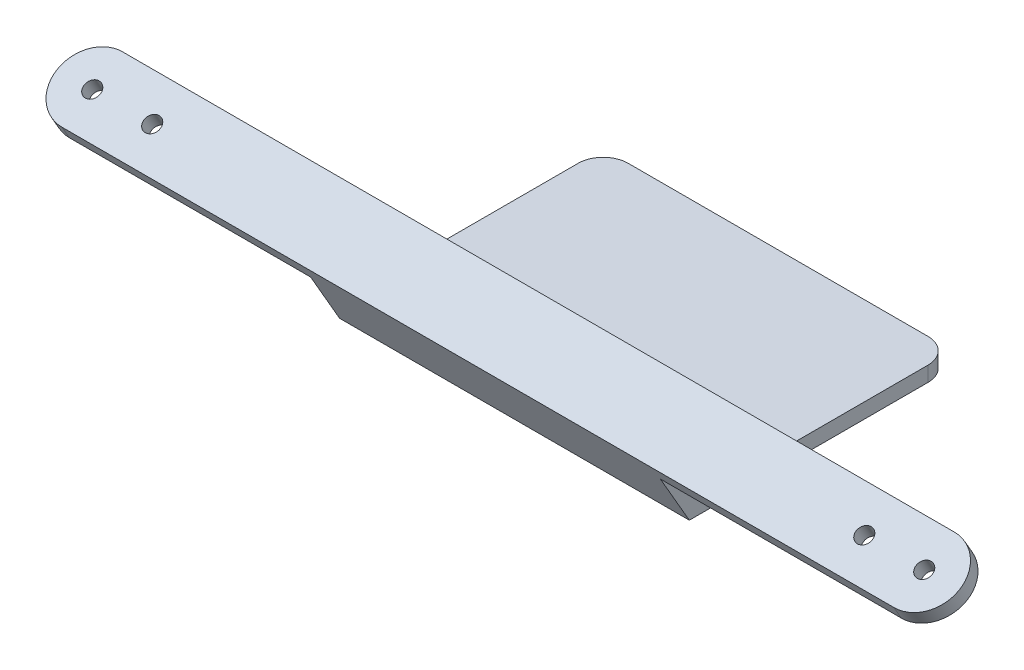
ISO-10303-21;
HEADER;
FILE_DESCRIPTION(('STEP AP214'),'2;1');
FILE_NAME('part.step','',(''),(''),'','','');
FILE_SCHEMA(('AUTOMOTIVE_DESIGN { 1 0 10303 214 1 1 1 1 }'));
ENDSEC;
DATA;
#1=APPLICATION_CONTEXT('core data for automotive mechanical design processes');
#2=APPLICATION_PROTOCOL_DEFINITION('international standard','automotive_design',2000,#1);
#3=PRODUCT_CONTEXT('',#1,'mechanical');
#4=PRODUCT('Part','Part','',(#3));
#5=PRODUCT_RELATED_PRODUCT_CATEGORY('part','',(#4));
#6=PRODUCT_DEFINITION_FORMATION('','',#4);
#7=PRODUCT_DEFINITION_CONTEXT('part definition',#1,'design');
#8=PRODUCT_DEFINITION('design','',#6,#7);
#9=PRODUCT_DEFINITION_SHAPE('','',#8);
#10=(LENGTH_UNIT() NAMED_UNIT(*) SI_UNIT(.MILLI.,.METRE.));
#11=(NAMED_UNIT(*) PLANE_ANGLE_UNIT() SI_UNIT($,.RADIAN.));
#12=(NAMED_UNIT(*) SI_UNIT($,.STERADIAN.) SOLID_ANGLE_UNIT());
#13=UNCERTAINTY_MEASURE_WITH_UNIT(LENGTH_MEASURE(1.E-05),#10,'distance_accuracy_value','');
#14=(GEOMETRIC_REPRESENTATION_CONTEXT(3) GLOBAL_UNCERTAINTY_ASSIGNED_CONTEXT((#13)) GLOBAL_UNIT_ASSIGNED_CONTEXT((#10,
#11,#12)) REPRESENTATION_CONTEXT('',''));
#15=CARTESIAN_POINT('',(0.,0.,0.));
#16=DIRECTION('',(0.,0.,1.));
#17=DIRECTION('',(1.,0.,0.));
#18=AXIS2_PLACEMENT_3D('',#15,#16,#17);
#19=CARTESIAN_POINT('',(93.3746923494621,15.,0.));
#20=DIRECTION('',(0.,-0.86602540378444,-0.499999999999998));
#21=DIRECTION('',(0.,0.499999999999998,-0.86602540378444));
#22=AXIS2_PLACEMENT_3D('',#19,#20,#21);
#23=PLANE('',#22);
#24=CARTESIAN_POINT('',(-36.265,13.5566243270259,2.49999999999999));
#25=DIRECTION('',(0.,-0.86602540378444,-0.499999999999998));
#26=DIRECTION('',(0.,0.499999999999998,-0.86602540378444));
#27=AXIS2_PLACEMENT_3D('',#24,#25,#26);
#28=CIRCLE('',#27,1.59999999999999);
#29=CARTESIAN_POINT('',(-36.265,14.3566243270259,1.11435935394489));
#30=VERTEX_POINT('',#29);
#31=EDGE_CURVE('E259',#30,#30,#28,.F.);
#32=ORIENTED_EDGE('',*,*,#31,.T.);
#33=EDGE_LOOP('',(#32));
#34=FACE_BOUND('',#33,.T.);
#35=CARTESIAN_POINT('',(-48.265,13.5566243270259,2.49999999999999));
#36=DIRECTION('',(0.,-0.86602540378444,-0.499999999999998));
#37=DIRECTION('',(0.,0.499999999999998,-0.86602540378444));
#38=AXIS2_PLACEMENT_3D('',#35,#36,#37);
#39=CIRCLE('',#38,1.6);
#40=CARTESIAN_POINT('',(-48.265,14.3566243270259,1.11435935394489));
#41=VERTEX_POINT('',#40);
#42=EDGE_CURVE('E262',#41,#41,#39,.F.);
#43=ORIENTED_EDGE('',*,*,#42,.T.);
#44=EDGE_LOOP('',(#43));
#45=FACE_BOUND('',#44,.T.);
#46=CARTESIAN_POINT('',(118.265,13.556624327026,2.49999999999999));
#47=DIRECTION('',(0.,-0.86602540378444,-0.499999999999998));
#48=DIRECTION('',(0.,0.499999999999998,-0.86602540378444));
#49=AXIS2_PLACEMENT_3D('',#46,#47,#48);
#50=CIRCLE('',#49,1.59999999999999);
#51=CARTESIAN_POINT('',(118.265,14.3566243270259,1.11435935394489));
#52=VERTEX_POINT('',#51);
#53=EDGE_CURVE('E265',#52,#52,#50,.F.);
#54=ORIENTED_EDGE('',*,*,#53,.T.);
#55=EDGE_LOOP('',(#54));
#56=FACE_BOUND('',#55,.T.);
#57=CARTESIAN_POINT('',(106.265,13.556624327026,2.49999999999999));
#58=DIRECTION('',(0.,-0.86602540378444,-0.499999999999998));
#59=DIRECTION('',(0.,0.499999999999998,-0.86602540378444));
#60=AXIS2_PLACEMENT_3D('',#57,#58,#59);
#61=CIRCLE('',#60,1.60000000000001);
#62=CARTESIAN_POINT('',(106.265,14.356624327026,1.11435935394488));
#63=VERTEX_POINT('',#62);
#64=EDGE_CURVE('E236',#63,#63,#61,.F.);
#65=ORIENTED_EDGE('',*,*,#64,.T.);
#66=EDGE_LOOP('',(#65));
#67=FACE_BOUND('',#66,.T.);
#68=DIRECTION('',(-1.,0.,0.));
#69=VECTOR('',#68,1.);
#70=CARTESIAN_POINT('',(-48.265,17.056624327026,-3.56217782649108));
#71=LINE('',#70,#69);
#72=CARTESIAN_POINT('',(118.265,17.0566243270259,-3.5621778264911));
#73=VERTEX_POINT('',#72);
#74=CARTESIAN_POINT('',(-48.265,17.056624327026,-3.56217782649108));
#75=VERTEX_POINT('',#74);
#76=EDGE_CURVE('E272',#73,#75,#71,.T.);
#77=ORIENTED_EDGE('',*,*,#76,.F.);
#78=CARTESIAN_POINT('',(118.265,13.556624327026,2.49999999999999));
#79=DIRECTION('',(0.,-0.86602540378444,-0.499999999999998));
#80=DIRECTION('',(0.,0.499999999999998,-0.86602540378444));
#81=AXIS2_PLACEMENT_3D('',#78,#79,#80);
#82=CIRCLE('',#81,7.00000000000002);
#83=CARTESIAN_POINT('',(118.265,10.0566243270259,8.56217782649107));
#84=VERTEX_POINT('',#83);
#85=EDGE_CURVE('E275',#84,#73,#82,.F.);
#86=ORIENTED_EDGE('',*,*,#85,.F.);
#87=DIRECTION('',(1.,0.,0.));
#88=VECTOR('',#87,1.);
#89=CARTESIAN_POINT('',(106.265,10.0566243270259,8.56217782649109));
#90=LINE('',#89,#88);
#91=CARTESIAN_POINT('',(70.,10.056624327026,8.56217782649104));
#92=VERTEX_POINT('',#91);
#93=EDGE_CURVE('E270',#92,#84,#90,.T.);
#94=ORIENTED_EDGE('',*,*,#93,.F.);
#95=DIRECTION('',(0.,-0.499999999999998,0.86602540378444));
#96=VECTOR('',#95,1.);
#97=CARTESIAN_POINT('',(70.,12.,5.19615242270662));
#98=LINE('',#97,#96);
#99=CARTESIAN_POINT('',(70.,15.,0.));
#100=VERTEX_POINT('',#99);
#101=EDGE_CURVE('E226',#100,#92,#98,.T.);
#102=ORIENTED_EDGE('',*,*,#101,.F.);
#103=DIRECTION('',(-1.,0.,0.));
#104=VECTOR('',#103,1.);
#105=CARTESIAN_POINT('',(93.3746923494621,15.,0.));
#106=LINE('',#105,#104);
#107=CARTESIAN_POINT('',(0.,15.,0.));
#108=VERTEX_POINT('',#107);
#109=EDGE_CURVE('E219',#100,#108,#106,.T.);
#110=ORIENTED_EDGE('',*,*,#109,.T.);
#111=DIRECTION('',(0.,0.499999999999998,-0.86602540378444));
#112=VECTOR('',#111,1.);
#113=CARTESIAN_POINT('',(0.,12.,5.19615242270662));
#114=LINE('',#113,#112);
#115=CARTESIAN_POINT('',(0.,10.0566243270261,8.56217782649089));
#116=VERTEX_POINT('',#115);
#117=EDGE_CURVE('E287',#116,#108,#114,.T.);
#118=ORIENTED_EDGE('',*,*,#117,.F.);
#119=CARTESIAN_POINT('',(-48.265,10.0566243270261,8.56217782649089));
#120=VERTEX_POINT('',#119);
#121=EDGE_CURVE('E166',#120,#116,#90,.T.);
#122=ORIENTED_EDGE('',*,*,#121,.F.);
#123=CARTESIAN_POINT('',(-48.265,13.5566243270259,2.49999999999999));
#124=DIRECTION('',(0.,-0.86602540378444,-0.499999999999998));
#125=DIRECTION('',(0.,0.499999999999998,-0.86602540378444));
#126=AXIS2_PLACEMENT_3D('',#123,#124,#125);
#127=CIRCLE('',#126,7.00000000000002);
#128=EDGE_CURVE('E228',#75,#120,#127,.F.);
#129=ORIENTED_EDGE('',*,*,#128,.F.);
#130=EDGE_LOOP('',(#77,#86,#94,#102,#110,#118,#122,#129));
#131=FACE_BOUND('',#130,.T.);
#132=ADVANCED_FACE('F48',(#34,#45,#56,#67,#131),#23,.T.);
#133=CARTESIAN_POINT('',(93.3746923494621,21.0980762113533,-4.56217782649108));
#134=DIRECTION('',(0.,0.86602540378444,0.499999999999998));
#135=DIRECTION('',(0.,-0.499999999999998,0.86602540378444));
#136=AXIS2_PLACEMENT_3D('',#133,#134,#135);
#137=PLANE('',#136);
#138=CARTESIAN_POINT('',(-36.265,16.1547005383793,4.));
#139=DIRECTION('',(0.,0.86602540378444,0.499999999999998));
#140=DIRECTION('',(0.,-0.499999999999998,0.86602540378444));
#141=AXIS2_PLACEMENT_3D('',#138,#139,#140);
#142=CIRCLE('',#141,1.59999999999999);
#143=CARTESIAN_POINT('',(-36.265,15.3547005383793,5.3856406460551));
#144=VERTEX_POINT('',#143);
#145=EDGE_CURVE('E247',#144,#144,#142,.T.);
#146=ORIENTED_EDGE('',*,*,#145,.F.);
#147=EDGE_LOOP('',(#146));
#148=FACE_BOUND('',#147,.T.);
#149=CARTESIAN_POINT('',(106.265,16.1547005383793,3.99999999999999));
#150=DIRECTION('',(0.,0.86602540378444,0.499999999999998));
#151=DIRECTION('',(0.,-0.499999999999998,0.86602540378444));
#152=AXIS2_PLACEMENT_3D('',#149,#150,#151);
#153=CIRCLE('',#152,1.60000000000001);
#154=CARTESIAN_POINT('',(106.265,15.3547005383793,5.3856406460551));
#155=VERTEX_POINT('',#154);
#156=EDGE_CURVE('E250',#155,#155,#153,.T.);
#157=ORIENTED_EDGE('',*,*,#156,.F.);
#158=EDGE_LOOP('',(#157));
#159=FACE_BOUND('',#158,.T.);
#160=CARTESIAN_POINT('',(-48.265,16.1547005383793,4.));
#161=DIRECTION('',(0.,0.86602540378444,0.499999999999998));
#162=DIRECTION('',(0.,-0.499999999999998,0.86602540378444));
#163=AXIS2_PLACEMENT_3D('',#160,#161,#162);
#164=CIRCLE('',#163,1.6);
#165=CARTESIAN_POINT('',(-48.265,15.3547005383793,5.3856406460551));
#166=VERTEX_POINT('',#165);
#167=EDGE_CURVE('E254',#166,#166,#164,.T.);
#168=ORIENTED_EDGE('',*,*,#167,.F.);
#169=EDGE_LOOP('',(#168));
#170=FACE_BOUND('',#169,.T.);
#171=CARTESIAN_POINT('',(118.265,16.1547005383793,3.99999999999999));
#172=DIRECTION('',(0.,0.86602540378444,0.499999999999998));
#173=DIRECTION('',(0.,-0.499999999999998,0.86602540378444));
#174=AXIS2_PLACEMENT_3D('',#171,#172,#173);
#175=CIRCLE('',#174,1.59999999999999);
#176=CARTESIAN_POINT('',(118.265,15.3547005383793,5.38564064605509));
#177=VERTEX_POINT('',#176);
#178=EDGE_CURVE('E246',#177,#177,#175,.T.);
#179=ORIENTED_EDGE('',*,*,#178,.F.);
#180=EDGE_LOOP('',(#179));
#181=FACE_BOUND('',#180,.T.);
#182=CARTESIAN_POINT('',(118.265,16.1547005383793,3.99999999999999));
#183=DIRECTION('',(0.,0.86602540378444,0.499999999999998));
#184=DIRECTION('',(0.,-0.499999999999998,0.86602540378444));
#185=AXIS2_PLACEMENT_3D('',#182,#183,#184);
#186=CIRCLE('',#185,7.00000000000002);
#187=CARTESIAN_POINT('',(118.265,12.6547005383793,10.0621778264911));
#188=VERTEX_POINT('',#187);
#189=CARTESIAN_POINT('',(118.265,19.6547005383793,-2.06217782649109));
#190=VERTEX_POINT('',#189);
#191=EDGE_CURVE('E237',#188,#190,#186,.T.);
#192=ORIENTED_EDGE('',*,*,#191,.T.);
#193=DIRECTION('',(-1.,0.,0.));
#194=VECTOR('',#193,1.);
#195=CARTESIAN_POINT('',(-48.265,19.6547005383793,-2.06217782649109));
#196=LINE('',#195,#194);
#197=CARTESIAN_POINT('',(-48.265,19.6547005383793,-2.06217782649109));
#198=VERTEX_POINT('',#197);
#199=EDGE_CURVE('E234',#190,#198,#196,.T.);
#200=ORIENTED_EDGE('',*,*,#199,.T.);
#201=CARTESIAN_POINT('',(-48.265,16.1547005383793,4.));
#202=DIRECTION('',(0.,0.86602540378444,0.499999999999998));
#203=DIRECTION('',(0.,-0.499999999999998,0.86602540378444));
#204=AXIS2_PLACEMENT_3D('',#201,#202,#203);
#205=CIRCLE('',#204,7.00000000000002);
#206=CARTESIAN_POINT('',(-48.265,12.6547005383793,10.0621778264911));
#207=VERTEX_POINT('',#206);
#208=EDGE_CURVE('E243',#198,#207,#205,.T.);
#209=ORIENTED_EDGE('',*,*,#208,.T.);
#210=DIRECTION('',(1.,0.,0.));
#211=VECTOR('',#210,1.);
#212=CARTESIAN_POINT('',(106.265,12.6547005383793,10.0621778264911));
#213=LINE('',#212,#211);
#214=EDGE_CURVE('E240',#207,#188,#213,.T.);
#215=ORIENTED_EDGE('',*,*,#214,.T.);
#216=EDGE_LOOP('',(#192,#200,#209,#215));
#217=FACE_BOUND('',#216,.T.);
#218=ADVANCED_FACE('F301',(#148,#159,#170,#181,#217),#137,.T.);
#219=CARTESIAN_POINT('',(0.,3.,0.));
#220=DIRECTION('',(1.,0.,0.));
#221=DIRECTION('',(0.,0.,-1.));
#222=AXIS2_PLACEMENT_3D('',#219,#220,#221);
#223=PLANE('',#222);
#224=DIRECTION('',(0.,0.,1.));
#225=VECTOR('',#224,1.);
#226=CARTESIAN_POINT('',(0.,3.,0.));
#227=LINE('',#226,#225);
#228=CARTESIAN_POINT('',(0.,3.,-45.));
#229=VERTEX_POINT('',#228);
#230=CARTESIAN_POINT('',(0.,3.,-5.));
#231=VERTEX_POINT('',#230);
#232=EDGE_CURVE('E191',#229,#231,#227,.T.);
#233=ORIENTED_EDGE('',*,*,#232,.F.);
#234=DIRECTION('',(0.,-1.,0.));
#235=VECTOR('',#234,1.);
#236=CARTESIAN_POINT('',(0.,3.,-45.));
#237=LINE('',#236,#235);
#238=CARTESIAN_POINT('',(0.,0.,-45.));
#239=VERTEX_POINT('',#238);
#240=EDGE_CURVE('E153',#229,#239,#237,.T.);
#241=ORIENTED_EDGE('',*,*,#240,.T.);
#242=DIRECTION('',(0.,0.,1.));
#243=VECTOR('',#242,1.);
#244=CARTESIAN_POINT('',(0.,0.,0.));
#245=LINE('',#244,#243);
#246=CARTESIAN_POINT('',(0.,0.,2.75598306414359));
#247=VERTEX_POINT('',#246);
#248=EDGE_CURVE('E146',#239,#247,#245,.T.);
#249=ORIENTED_EDGE('',*,*,#248,.T.);
#250=DIRECTION('',(0.,0.86602540378444,0.499999999999998));
#251=VECTOR('',#250,1.);
#252=CARTESIAN_POINT('',(0.,-85.0841412718303,-46.3673688029156));
#253=LINE('',#252,#251);
#254=EDGE_CURVE('E150',#247,#116,#253,.T.);
#255=ORIENTED_EDGE('',*,*,#254,.T.);
#256=ORIENTED_EDGE('',*,*,#117,.T.);
#257=DIRECTION('',(0.,-1.,0.));
#258=VECTOR('',#257,1.);
#259=CARTESIAN_POINT('',(0.,0.,0.));
#260=LINE('',#259,#258);
#261=CARTESIAN_POINT('',(0.,8.,0.));
#262=VERTEX_POINT('',#261);
#263=EDGE_CURVE('E288',#108,#262,#260,.T.);
#264=ORIENTED_EDGE('',*,*,#263,.T.);
#265=CARTESIAN_POINT('',(0.,8.,-5.));
#266=DIRECTION('',(1.,0.,0.));
#267=DIRECTION('',(0.,0.,-1.));
#268=AXIS2_PLACEMENT_3D('',#265,#266,#267);
#269=CIRCLE('',#268,5.);
#270=EDGE_CURVE('E170',#262,#231,#269,.T.);
#271=ORIENTED_EDGE('',*,*,#270,.T.);
#272=EDGE_LOOP('',(#233,#241,#249,#255,#256,#264,#271));
#273=FACE_BOUND('',#272,.T.);
#274=ADVANCED_FACE('F149',(#273),#223,.F.);
#275=CARTESIAN_POINT('',(70.,3.,0.));
#276=DIRECTION('',(-1.,0.,0.));
#277=DIRECTION('',(0.,0.,1.));
#278=AXIS2_PLACEMENT_3D('',#275,#276,#277);
#279=PLANE('',#278);
#280=DIRECTION('',(0.,0.,-1.));
#281=VECTOR('',#280,1.);
#282=CARTESIAN_POINT('',(70.,0.,0.));
#283=LINE('',#282,#281);
#284=CARTESIAN_POINT('',(69.9999999999999,0.,2.75598306414368));
#285=VERTEX_POINT('',#284);
#286=CARTESIAN_POINT('',(70.,0.,-45.));
#287=VERTEX_POINT('',#286);
#288=EDGE_CURVE('E156',#285,#287,#283,.T.);
#289=ORIENTED_EDGE('',*,*,#288,.T.);
#290=DIRECTION('',(0.,-1.,0.));
#291=VECTOR('',#290,1.);
#292=CARTESIAN_POINT('',(70.,3.,-45.));
#293=LINE('',#292,#291);
#294=CARTESIAN_POINT('',(70.,3.,-45.));
#295=VERTEX_POINT('',#294);
#296=EDGE_CURVE('E12',#287,#295,#293,.F.);
#297=ORIENTED_EDGE('',*,*,#296,.T.);
#298=DIRECTION('',(0.,0.,-1.));
#299=VECTOR('',#298,1.);
#300=CARTESIAN_POINT('',(70.,3.,0.));
#301=LINE('',#300,#299);
#302=CARTESIAN_POINT('',(70.,3.,-5.));
#303=VERTEX_POINT('',#302);
#304=EDGE_CURVE('E197',#303,#295,#301,.T.);
#305=ORIENTED_EDGE('',*,*,#304,.F.);
#306=CARTESIAN_POINT('',(70.,8.,-5.));
#307=DIRECTION('',(-1.,0.,0.));
#308=DIRECTION('',(0.,0.,1.));
#309=AXIS2_PLACEMENT_3D('',#306,#307,#308);
#310=CIRCLE('',#309,5.);
#311=CARTESIAN_POINT('',(70.,8.,0.));
#312=VERTEX_POINT('',#311);
#313=EDGE_CURVE('E175',#303,#312,#310,.T.);
#314=ORIENTED_EDGE('',*,*,#313,.T.);
#315=DIRECTION('',(0.,1.,0.));
#316=VECTOR('',#315,1.);
#317=CARTESIAN_POINT('',(70.,0.,0.));
#318=LINE('',#317,#316);
#319=EDGE_CURVE('E157',#312,#100,#318,.T.);
#320=ORIENTED_EDGE('',*,*,#319,.T.);
#321=ORIENTED_EDGE('',*,*,#101,.T.);
#322=DIRECTION('',(0.,0.86602540378444,0.499999999999998));
#323=VECTOR('',#322,1.);
#324=CARTESIAN_POINT('',(70.,-85.0841412718303,-46.3673688029156));
#325=LINE('',#324,#323);
#326=EDGE_CURVE('E167',#285,#92,#325,.T.);
#327=ORIENTED_EDGE('',*,*,#326,.F.);
#328=EDGE_LOOP('',(#289,#297,#305,#314,#320,#321,#327));
#329=FACE_BOUND('',#328,.T.);
#330=ADVANCED_FACE('F211',(#329),#279,.F.);
#331=CARTESIAN_POINT('',(0.,0.,0.));
#332=DIRECTION('',(0.,-1.,0.));
#333=DIRECTION('',(0.,0.,-1.));
#334=AXIS2_PLACEMENT_3D('',#331,#332,#333);
#335=PLANE('',#334);
#336=ORIENTED_EDGE('',*,*,#248,.F.);
#337=CARTESIAN_POINT('',(5.,0.,-45.));
#338=DIRECTION('',(0.,-1.,0.));
#339=DIRECTION('',(0.,0.,-1.));
#340=AXIS2_PLACEMENT_3D('',#337,#338,#339);
#341=CIRCLE('',#340,5.);
#342=CARTESIAN_POINT('',(5.,0.,-50.));
#343=VERTEX_POINT('',#342);
#344=EDGE_CURVE('E180',#239,#343,#341,.T.);
#345=ORIENTED_EDGE('',*,*,#344,.T.);
#346=DIRECTION('',(-1.,0.,0.));
#347=VECTOR('',#346,1.);
#348=CARTESIAN_POINT('',(0.,0.,-50.));
#349=LINE('',#348,#347);
#350=CARTESIAN_POINT('',(65.,0.,-50.));
#351=VERTEX_POINT('',#350);
#352=EDGE_CURVE('E198',#351,#343,#349,.T.);
#353=ORIENTED_EDGE('',*,*,#352,.F.);
#354=CARTESIAN_POINT('',(65.,0.,-45.));
#355=DIRECTION('',(0.,-1.,0.));
#356=DIRECTION('',(0.,0.,-1.));
#357=AXIS2_PLACEMENT_3D('',#354,#355,#356);
#358=CIRCLE('',#357,5.);
#359=EDGE_CURVE('E172',#351,#287,#358,.T.);
#360=ORIENTED_EDGE('',*,*,#359,.T.);
#361=ORIENTED_EDGE('',*,*,#288,.F.);
#362=DIRECTION('',(-1.,0.,0.));
#363=VECTOR('',#362,1.);
#364=CARTESIAN_POINT('',(0.,0.,2.75598306414357));
#365=LINE('',#364,#363);
#366=EDGE_CURVE('E164',#285,#247,#365,.T.);
#367=ORIENTED_EDGE('',*,*,#366,.T.);
#368=EDGE_LOOP('',(#336,#345,#353,#360,#361,#367));
#369=FACE_BOUND('',#368,.T.);
#370=ADVANCED_FACE('F169',(#369),#335,.T.);
#371=CARTESIAN_POINT('',(0.,3.,-50.));
#372=DIRECTION('',(0.,0.,1.));
#373=DIRECTION('',(1.,0.,0.));
#374=AXIS2_PLACEMENT_3D('',#371,#372,#373);
#375=PLANE('',#374);
#376=ORIENTED_EDGE('',*,*,#352,.T.);
#377=DIRECTION('',(0.,-1.,0.));
#378=VECTOR('',#377,1.);
#379=CARTESIAN_POINT('',(5.,3.,-50.));
#380=LINE('',#379,#378);
#381=CARTESIAN_POINT('',(5.,3.,-50.));
#382=VERTEX_POINT('',#381);
#383=EDGE_CURVE('E69',#343,#382,#380,.F.);
#384=ORIENTED_EDGE('',*,*,#383,.T.);
#385=DIRECTION('',(-1.,0.,0.));
#386=VECTOR('',#385,1.);
#387=CARTESIAN_POINT('',(0.,3.,-50.));
#388=LINE('',#387,#386);
#389=CARTESIAN_POINT('',(65.,3.,-50.));
#390=VERTEX_POINT('',#389);
#391=EDGE_CURVE('E192',#390,#382,#388,.T.);
#392=ORIENTED_EDGE('',*,*,#391,.F.);
#393=DIRECTION('',(0.,-1.,0.));
#394=VECTOR('',#393,1.);
#395=CARTESIAN_POINT('',(65.,3.,-50.));
#396=LINE('',#395,#394);
#397=EDGE_CURVE('E182',#390,#351,#396,.T.);
#398=ORIENTED_EDGE('',*,*,#397,.T.);
#399=EDGE_LOOP('',(#376,#384,#392,#398));
#400=FACE_BOUND('',#399,.T.);
#401=ADVANCED_FACE('F202',(#400),#375,.F.);
#402=CARTESIAN_POINT('',(0.,3.,0.));
#403=DIRECTION('',(0.,-1.,0.));
#404=DIRECTION('',(0.,0.,-1.));
#405=AXIS2_PLACEMENT_3D('',#402,#403,#404);
#406=PLANE('',#405);
#407=ORIENTED_EDGE('',*,*,#391,.T.);
#408=CARTESIAN_POINT('',(5.,3.,-45.));
#409=DIRECTION('',(0.,-1.,0.));
#410=DIRECTION('',(0.,0.,-1.));
#411=AXIS2_PLACEMENT_3D('',#408,#409,#410);
#412=CIRCLE('',#411,5.);
#413=EDGE_CURVE('E56',#382,#229,#412,.F.);
#414=ORIENTED_EDGE('',*,*,#413,.T.);
#415=ORIENTED_EDGE('',*,*,#232,.T.);
#416=DIRECTION('',(1.,0.,0.));
#417=VECTOR('',#416,1.);
#418=CARTESIAN_POINT('',(0.,3.,-5.));
#419=LINE('',#418,#417);
#420=EDGE_CURVE('E207',#231,#303,#419,.T.);
#421=ORIENTED_EDGE('',*,*,#420,.T.);
#422=ORIENTED_EDGE('',*,*,#304,.T.);
#423=CARTESIAN_POINT('',(65.,3.,-45.));
#424=DIRECTION('',(0.,-1.,0.));
#425=DIRECTION('',(0.,0.,-1.));
#426=AXIS2_PLACEMENT_3D('',#423,#424,#425);
#427=CIRCLE('',#426,5.);
#428=EDGE_CURVE('E186',#295,#390,#427,.F.);
#429=ORIENTED_EDGE('',*,*,#428,.T.);
#430=EDGE_LOOP('',(#407,#414,#415,#421,#422,#429));
#431=FACE_BOUND('',#430,.T.);
#432=ADVANCED_FACE('F189',(#431),#406,.F.);
#433=CARTESIAN_POINT('',(93.3746923494621,0.,0.));
#434=DIRECTION('',(0.,0.,-1.));
#435=DIRECTION('',(-1.,0.,0.));
#436=AXIS2_PLACEMENT_3D('',#433,#434,#435);
#437=PLANE('',#436);
#438=ORIENTED_EDGE('',*,*,#319,.F.);
#439=DIRECTION('',(1.,0.,0.));
#440=VECTOR('',#439,1.);
#441=CARTESIAN_POINT('',(93.3746923494621,8.,0.));
#442=LINE('',#441,#440);
#443=EDGE_CURVE('E209',#312,#262,#442,.F.);
#444=ORIENTED_EDGE('',*,*,#443,.T.);
#445=ORIENTED_EDGE('',*,*,#263,.F.);
#446=ORIENTED_EDGE('',*,*,#109,.F.);
#447=EDGE_LOOP('',(#438,#444,#445,#446));
#448=FACE_BOUND('',#447,.T.);
#449=ADVANCED_FACE('F216',(#448),#437,.T.);
#450=CARTESIAN_POINT('',(-48.265,-139.756355604484,-94.0981940023751));
#451=DIRECTION('',(0.,0.499999999999998,-0.86602540378444));
#452=DIRECTION('',(0.,0.86602540378444,0.499999999999998));
#453=AXIS2_PLACEMENT_3D('',#450,#451,#452);
#454=PLANE('',#453);
#455=ORIENTED_EDGE('',*,*,#199,.F.);
#456=DIRECTION('',(0.,0.86602540378444,0.499999999999998));
#457=VECTOR('',#456,1.);
#458=CARTESIAN_POINT('',(118.265,-139.756355604484,-94.0981940023751));
#459=LINE('',#458,#457);
#460=EDGE_CURVE('E278',#73,#190,#459,.T.);
#461=ORIENTED_EDGE('',*,*,#460,.F.);
#462=ORIENTED_EDGE('',*,*,#76,.T.);
#463=DIRECTION('',(0.,0.86602540378444,0.499999999999998));
#464=VECTOR('',#463,1.);
#465=CARTESIAN_POINT('',(-48.265,-139.756355604484,-94.0981940023751));
#466=LINE('',#465,#464);
#467=EDGE_CURVE('E274',#75,#198,#466,.T.);
#468=ORIENTED_EDGE('',*,*,#467,.T.);
#469=EDGE_LOOP('',(#455,#461,#462,#468));
#470=FACE_BOUND('',#469,.T.);
#471=ADVANCED_FACE('F308',(#470),#454,.T.);
#472=CARTESIAN_POINT('',(-48.265,-143.256355604484,-88.036016175884));
#473=DIRECTION('',(0.,0.86602540378444,0.499999999999998));
#474=DIRECTION('',(0.,-0.499999999999998,0.86602540378444));
#475=AXIS2_PLACEMENT_3D('',#472,#473,#474);
#476=CYLINDRICAL_SURFACE('',#475,7.00000000000002);
#477=ORIENTED_EDGE('',*,*,#467,.F.);
#478=ORIENTED_EDGE('',*,*,#128,.T.);
#479=DIRECTION('',(0.,0.86602540378444,0.499999999999998));
#480=VECTOR('',#479,1.);
#481=CARTESIAN_POINT('',(-48.265,-146.756355604484,-81.9738383493929));
#482=LINE('',#481,#480);
#483=EDGE_CURVE('E231',#120,#207,#482,.T.);
#484=ORIENTED_EDGE('',*,*,#483,.T.);
#485=ORIENTED_EDGE('',*,*,#208,.F.);
#486=EDGE_LOOP('',(#477,#478,#484,#485));
#487=FACE_BOUND('',#486,.T.);
#488=ADVANCED_FACE('F305',(#487),#476,.T.);
#489=CARTESIAN_POINT('',(118.265,-143.256355604484,-88.036016175884));
#490=DIRECTION('',(0.,0.86602540378444,0.499999999999998));
#491=DIRECTION('',(0.,-0.499999999999998,0.86602540378444));
#492=AXIS2_PLACEMENT_3D('',#489,#490,#491);
#493=CYLINDRICAL_SURFACE('',#492,7.00000000000002);
#494=DIRECTION('',(0.,0.86602540378444,0.499999999999998));
#495=VECTOR('',#494,1.);
#496=CARTESIAN_POINT('',(118.265,-146.756355604484,-81.9738383493929));
#497=LINE('',#496,#495);
#498=EDGE_CURVE('E251',#84,#188,#497,.T.);
#499=ORIENTED_EDGE('',*,*,#498,.F.);
#500=ORIENTED_EDGE('',*,*,#85,.T.);
#501=ORIENTED_EDGE('',*,*,#460,.T.);
#502=ORIENTED_EDGE('',*,*,#191,.F.);
#503=EDGE_LOOP('',(#499,#500,#501,#502));
#504=FACE_BOUND('',#503,.T.);
#505=ADVANCED_FACE('F298',(#504),#493,.T.);
#506=CARTESIAN_POINT('',(106.265,-146.756355604484,-81.9738383493929));
#507=DIRECTION('',(0.,-0.499999999999998,0.86602540378444));
#508=DIRECTION('',(0.,-0.86602540378444,-0.499999999999998));
#509=AXIS2_PLACEMENT_3D('',#506,#507,#508);
#510=PLANE('',#509);
#511=ORIENTED_EDGE('',*,*,#483,.F.);
#512=ORIENTED_EDGE('',*,*,#121,.T.);
#513=ORIENTED_EDGE('',*,*,#254,.F.);
#514=ORIENTED_EDGE('',*,*,#366,.F.);
#515=ORIENTED_EDGE('',*,*,#326,.T.);
#516=ORIENTED_EDGE('',*,*,#93,.T.);
#517=ORIENTED_EDGE('',*,*,#498,.T.);
#518=ORIENTED_EDGE('',*,*,#214,.F.);
#519=EDGE_LOOP('',(#511,#512,#513,#514,#515,#516,#517,#518));
#520=FACE_BOUND('',#519,.T.);
#521=ADVANCED_FACE('F162',(#520),#510,.T.);
#522=CARTESIAN_POINT('',(-36.265,-143.256355604484,-88.036016175884));
#523=DIRECTION('',(0.,0.86602540378444,0.499999999999998));
#524=DIRECTION('',(0.,-0.499999999999998,0.86602540378444));
#525=AXIS2_PLACEMENT_3D('',#522,#523,#524);
#526=CYLINDRICAL_SURFACE('',#525,1.59999999999999);
#527=ORIENTED_EDGE('',*,*,#145,.T.);
#528=EDGE_LOOP('',(#527));
#529=FACE_BOUND('',#528,.T.);
#530=ORIENTED_EDGE('',*,*,#31,.F.);
#531=EDGE_LOOP('',(#530));
#532=FACE_BOUND('',#531,.T.);
#533=ADVANCED_FACE('F416',(#529,#532),#526,.F.);
#534=CARTESIAN_POINT('',(106.265,-143.256355604484,-88.036016175884));
#535=DIRECTION('',(0.,0.86602540378444,0.499999999999998));
#536=DIRECTION('',(0.,-0.499999999999998,0.86602540378444));
#537=AXIS2_PLACEMENT_3D('',#534,#535,#536);
#538=CYLINDRICAL_SURFACE('',#537,1.60000000000001);
#539=ORIENTED_EDGE('',*,*,#156,.T.);
#540=EDGE_LOOP('',(#539));
#541=FACE_BOUND('',#540,.T.);
#542=ORIENTED_EDGE('',*,*,#64,.F.);
#543=EDGE_LOOP('',(#542));
#544=FACE_BOUND('',#543,.T.);
#545=ADVANCED_FACE('F453',(#541,#544),#538,.F.);
#546=CARTESIAN_POINT('',(-48.265,-143.256355604484,-88.036016175884));
#547=DIRECTION('',(0.,0.86602540378444,0.499999999999998));
#548=DIRECTION('',(0.,-0.499999999999998,0.86602540378444));
#549=AXIS2_PLACEMENT_3D('',#546,#547,#548);
#550=CYLINDRICAL_SURFACE('',#549,1.6);
#551=ORIENTED_EDGE('',*,*,#167,.T.);
#552=EDGE_LOOP('',(#551));
#553=FACE_BOUND('',#552,.T.);
#554=ORIENTED_EDGE('',*,*,#42,.F.);
#555=EDGE_LOOP('',(#554));
#556=FACE_BOUND('',#555,.T.);
#557=ADVANCED_FACE('F443',(#553,#556),#550,.F.);
#558=CARTESIAN_POINT('',(118.265,-143.256355604484,-88.036016175884));
#559=DIRECTION('',(0.,0.86602540378444,0.499999999999998));
#560=DIRECTION('',(0.,-0.499999999999998,0.86602540378444));
#561=AXIS2_PLACEMENT_3D('',#558,#559,#560);
#562=CYLINDRICAL_SURFACE('',#561,1.59999999999999);
#563=ORIENTED_EDGE('',*,*,#178,.T.);
#564=EDGE_LOOP('',(#563));
#565=FACE_BOUND('',#564,.T.);
#566=ORIENTED_EDGE('',*,*,#53,.F.);
#567=EDGE_LOOP('',(#566));
#568=FACE_BOUND('',#567,.T.);
#569=ADVANCED_FACE('F328',(#565,#568),#562,.F.);
#570=CARTESIAN_POINT('',(0.,8.,-5.));
#571=DIRECTION('',(1.,0.,0.));
#572=DIRECTION('',(0.,0.,-1.));
#573=AXIS2_PLACEMENT_3D('',#570,#571,#572);
#574=CYLINDRICAL_SURFACE('',#573,5.);
#575=ORIENTED_EDGE('',*,*,#270,.F.);
#576=ORIENTED_EDGE('',*,*,#443,.F.);
#577=ORIENTED_EDGE('',*,*,#313,.F.);
#578=ORIENTED_EDGE('',*,*,#420,.F.);
#579=EDGE_LOOP('',(#575,#576,#577,#578));
#580=FACE_BOUND('',#579,.T.);
#581=ADVANCED_FACE('F222',(#580),#574,.F.);
#582=CARTESIAN_POINT('',(5.,3.,-45.));
#583=DIRECTION('',(0.,-1.,0.));
#584=DIRECTION('',(0.,0.,-1.));
#585=AXIS2_PLACEMENT_3D('',#582,#583,#584);
#586=CYLINDRICAL_SURFACE('',#585,5.);
#587=ORIENTED_EDGE('',*,*,#413,.F.);
#588=ORIENTED_EDGE('',*,*,#383,.F.);
#589=ORIENTED_EDGE('',*,*,#344,.F.);
#590=ORIENTED_EDGE('',*,*,#240,.F.);
#591=EDGE_LOOP('',(#587,#588,#589,#590));
#592=FACE_BOUND('',#591,.T.);
#593=ADVANCED_FACE('F200',(#592),#586,.T.);
#594=CARTESIAN_POINT('',(65.,3.,-45.));
#595=DIRECTION('',(0.,-1.,0.));
#596=DIRECTION('',(0.,0.,-1.));
#597=AXIS2_PLACEMENT_3D('',#594,#595,#596);
#598=CYLINDRICAL_SURFACE('',#597,5.);
#599=ORIENTED_EDGE('',*,*,#428,.F.);
#600=ORIENTED_EDGE('',*,*,#296,.F.);
#601=ORIENTED_EDGE('',*,*,#359,.F.);
#602=ORIENTED_EDGE('',*,*,#397,.F.);
#603=EDGE_LOOP('',(#599,#600,#601,#602));
#604=FACE_BOUND('',#603,.T.);
#605=ADVANCED_FACE('F50',(#604),#598,.T.);
#606=CLOSED_SHELL('',(#132,#218,#274,#330,#370,#401,#432,#449,#471,#488,#505,#521,#533,#545,
#557,#569,#581,#593,#605));
#607=MANIFOLD_SOLID_BREP('B2',#606);
#608=ADVANCED_BREP_SHAPE_REPRESENTATION('',(#18,#607),#14);
#609=SHAPE_DEFINITION_REPRESENTATION(#9,#608);
ENDSEC;
END-ISO-10303-21;
